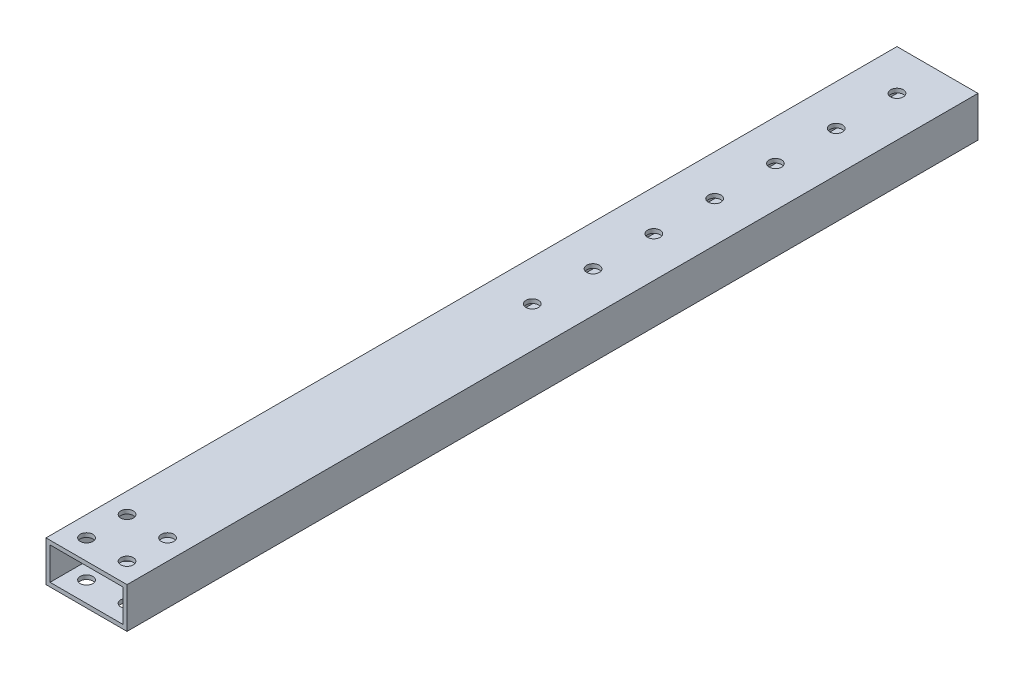
ISO-10303-21;
HEADER;
FILE_DESCRIPTION(('STEP AP214'),'2;1');
FILE_NAME('part.step','',(''),(''),'','','');
FILE_SCHEMA(('AUTOMOTIVE_DESIGN { 1 0 10303 214 1 1 1 1 }'));
ENDSEC;
DATA;
#1=APPLICATION_CONTEXT('core data for automotive mechanical design processes');
#2=APPLICATION_PROTOCOL_DEFINITION('international standard','automotive_design',2000,#1);
#3=PRODUCT_CONTEXT('',#1,'mechanical');
#4=PRODUCT('Part','Part','',(#3));
#5=PRODUCT_RELATED_PRODUCT_CATEGORY('part','',(#4));
#6=PRODUCT_DEFINITION_FORMATION('','',#4);
#7=PRODUCT_DEFINITION_CONTEXT('part definition',#1,'design');
#8=PRODUCT_DEFINITION('design','',#6,#7);
#9=PRODUCT_DEFINITION_SHAPE('','',#8);
#10=(LENGTH_UNIT() NAMED_UNIT(*) SI_UNIT(.MILLI.,.METRE.));
#11=(NAMED_UNIT(*) PLANE_ANGLE_UNIT() SI_UNIT($,.RADIAN.));
#12=(NAMED_UNIT(*) SI_UNIT($,.STERADIAN.) SOLID_ANGLE_UNIT());
#13=UNCERTAINTY_MEASURE_WITH_UNIT(LENGTH_MEASURE(1.E-05),#10,'distance_accuracy_value','');
#14=(GEOMETRIC_REPRESENTATION_CONTEXT(3) GLOBAL_UNCERTAINTY_ASSIGNED_CONTEXT((#13)) GLOBAL_UNIT_ASSIGNED_CONTEXT((#10,
#11,#12)) REPRESENTATION_CONTEXT('',''));
#15=CARTESIAN_POINT('',(0.,0.,0.));
#16=DIRECTION('',(0.,0.,1.));
#17=DIRECTION('',(1.,0.,0.));
#18=AXIS2_PLACEMENT_3D('',#15,#16,#17);
#19=CARTESIAN_POINT('',(0.,0.,-210.));
#20=DIRECTION('',(0.,0.,1.));
#21=DIRECTION('',(-1.,0.,0.));
#22=AXIS2_PLACEMENT_3D('',#19,#20,#21);
#23=PLANE('',#22);
#24=DIRECTION('',(0.,-1.,0.));
#25=VECTOR('',#24,1.);
#26=CARTESIAN_POINT('',(0.,0.,-210.));
#27=LINE('',#26,#25);
#28=CARTESIAN_POINT('',(0.,10.,-210.));
#29=VERTEX_POINT('',#28);
#30=CARTESIAN_POINT('',(0.,0.,-210.));
#31=VERTEX_POINT('',#30);
#32=EDGE_CURVE('E167',#29,#31,#27,.T.);
#33=ORIENTED_EDGE('',*,*,#32,.F.);
#34=DIRECTION('',(-1.,0.,0.));
#35=VECTOR('',#34,1.);
#36=CARTESIAN_POINT('',(0.,10.,-210.));
#37=LINE('',#36,#35);
#38=CARTESIAN_POINT('',(20.,10.,-210.));
#39=VERTEX_POINT('',#38);
#40=EDGE_CURVE('E180',#39,#29,#37,.T.);
#41=ORIENTED_EDGE('',*,*,#40,.F.);
#42=DIRECTION('',(0.,1.,0.));
#43=VECTOR('',#42,1.);
#44=CARTESIAN_POINT('',(20.,0.,-210.));
#45=LINE('',#44,#43);
#46=CARTESIAN_POINT('',(20.,0.,-210.));
#47=VERTEX_POINT('',#46);
#48=EDGE_CURVE('E176',#47,#39,#45,.T.);
#49=ORIENTED_EDGE('',*,*,#48,.F.);
#50=DIRECTION('',(1.,0.,0.));
#51=VECTOR('',#50,1.);
#52=CARTESIAN_POINT('',(0.,0.,-210.));
#53=LINE('',#52,#51);
#54=EDGE_CURVE('E171',#31,#47,#53,.T.);
#55=ORIENTED_EDGE('',*,*,#54,.F.);
#56=EDGE_LOOP('',(#33,#41,#49,#55));
#57=FACE_BOUND('',#56,.T.);
#58=DIRECTION('',(1.,0.,0.));
#59=VECTOR('',#58,1.);
#60=CARTESIAN_POINT('',(1.,1.,-210.));
#61=LINE('',#60,#59);
#62=CARTESIAN_POINT('',(1.,1.,-210.));
#63=VERTEX_POINT('',#62);
#64=CARTESIAN_POINT('',(19.,1.,-210.));
#65=VERTEX_POINT('',#64);
#66=EDGE_CURVE('E119',#63,#65,#61,.T.);
#67=ORIENTED_EDGE('',*,*,#66,.T.);
#68=DIRECTION('',(0.,1.,0.));
#69=VECTOR('',#68,1.);
#70=CARTESIAN_POINT('',(19.,1.,-210.));
#71=LINE('',#70,#69);
#72=CARTESIAN_POINT('',(19.,9.,-210.));
#73=VERTEX_POINT('',#72);
#74=EDGE_CURVE('E129',#65,#73,#71,.T.);
#75=ORIENTED_EDGE('',*,*,#74,.T.);
#76=DIRECTION('',(-1.,0.,0.));
#77=VECTOR('',#76,1.);
#78=CARTESIAN_POINT('',(1.,9.,-210.));
#79=LINE('',#78,#77);
#80=CARTESIAN_POINT('',(1.,9.,-210.));
#81=VERTEX_POINT('',#80);
#82=EDGE_CURVE('E134',#73,#81,#79,.T.);
#83=ORIENTED_EDGE('',*,*,#82,.T.);
#84=DIRECTION('',(0.,-1.,0.));
#85=VECTOR('',#84,1.);
#86=CARTESIAN_POINT('',(1.,1.,-210.));
#87=LINE('',#86,#85);
#88=EDGE_CURVE('E137',#81,#63,#87,.T.);
#89=ORIENTED_EDGE('',*,*,#88,.T.);
#90=EDGE_LOOP('',(#67,#75,#83,#89));
#91=FACE_BOUND('',#90,.T.);
#92=ADVANCED_FACE('F49',(#57,#91),#23,.F.);
#93=CARTESIAN_POINT('',(0.,0.,0.));
#94=DIRECTION('',(0.,0.,1.));
#95=DIRECTION('',(-1.,0.,0.));
#96=AXIS2_PLACEMENT_3D('',#93,#94,#95);
#97=PLANE('',#96);
#98=DIRECTION('',(0.,-1.,0.));
#99=VECTOR('',#98,1.);
#100=CARTESIAN_POINT('',(0.,0.,0.));
#101=LINE('',#100,#99);
#102=CARTESIAN_POINT('',(0.,10.,0.));
#103=VERTEX_POINT('',#102);
#104=CARTESIAN_POINT('',(0.,0.,0.));
#105=VERTEX_POINT('',#104);
#106=EDGE_CURVE('E125',#103,#105,#101,.T.);
#107=ORIENTED_EDGE('',*,*,#106,.T.);
#108=DIRECTION('',(1.,0.,0.));
#109=VECTOR('',#108,1.);
#110=CARTESIAN_POINT('',(0.,0.,0.));
#111=LINE('',#110,#109);
#112=CARTESIAN_POINT('',(20.,0.,0.));
#113=VERTEX_POINT('',#112);
#114=EDGE_CURVE('E187',#105,#113,#111,.T.);
#115=ORIENTED_EDGE('',*,*,#114,.T.);
#116=DIRECTION('',(0.,1.,0.));
#117=VECTOR('',#116,1.);
#118=CARTESIAN_POINT('',(20.,0.,0.));
#119=LINE('',#118,#117);
#120=CARTESIAN_POINT('',(20.,10.,0.));
#121=VERTEX_POINT('',#120);
#122=EDGE_CURVE('E191',#113,#121,#119,.T.);
#123=ORIENTED_EDGE('',*,*,#122,.T.);
#124=DIRECTION('',(-1.,0.,0.));
#125=VECTOR('',#124,1.);
#126=CARTESIAN_POINT('',(0.,10.,0.));
#127=LINE('',#126,#125);
#128=EDGE_CURVE('E172',#121,#103,#127,.T.);
#129=ORIENTED_EDGE('',*,*,#128,.T.);
#130=EDGE_LOOP('',(#107,#115,#123,#129));
#131=FACE_BOUND('',#130,.T.);
#132=DIRECTION('',(0.,-1.,0.));
#133=VECTOR('',#132,1.);
#134=CARTESIAN_POINT('',(1.,1.,0.));
#135=LINE('',#134,#133);
#136=CARTESIAN_POINT('',(1.,9.,0.));
#137=VERTEX_POINT('',#136);
#138=CARTESIAN_POINT('',(1.,1.,0.));
#139=VERTEX_POINT('',#138);
#140=EDGE_CURVE('E139',#137,#139,#135,.T.);
#141=ORIENTED_EDGE('',*,*,#140,.F.);
#142=DIRECTION('',(-1.,0.,0.));
#143=VECTOR('',#142,1.);
#144=CARTESIAN_POINT('',(1.,9.,0.));
#145=LINE('',#144,#143);
#146=CARTESIAN_POINT('',(19.,9.,0.));
#147=VERTEX_POINT('',#146);
#148=EDGE_CURVE('E144',#147,#137,#145,.T.);
#149=ORIENTED_EDGE('',*,*,#148,.F.);
#150=DIRECTION('',(0.,1.,0.));
#151=VECTOR('',#150,1.);
#152=CARTESIAN_POINT('',(19.,1.,0.));
#153=LINE('',#152,#151);
#154=CARTESIAN_POINT('',(19.,1.,0.));
#155=VERTEX_POINT('',#154);
#156=EDGE_CURVE('E156',#155,#147,#153,.T.);
#157=ORIENTED_EDGE('',*,*,#156,.F.);
#158=DIRECTION('',(1.,0.,0.));
#159=VECTOR('',#158,1.);
#160=CARTESIAN_POINT('',(1.,1.,0.));
#161=LINE('',#160,#159);
#162=EDGE_CURVE('E120',#139,#155,#161,.T.);
#163=ORIENTED_EDGE('',*,*,#162,.F.);
#164=EDGE_LOOP('',(#141,#149,#157,#163));
#165=FACE_BOUND('',#164,.T.);
#166=ADVANCED_FACE('F337',(#131,#165),#97,.T.);
#167=CARTESIAN_POINT('',(0.,0.,-210.));
#168=DIRECTION('',(1.,0.,0.));
#169=DIRECTION('',(0.,0.,1.));
#170=AXIS2_PLACEMENT_3D('',#167,#168,#169);
#171=PLANE('',#170);
#172=ORIENTED_EDGE('',*,*,#106,.F.);
#173=DIRECTION('',(0.,0.,1.));
#174=VECTOR('',#173,1.);
#175=CARTESIAN_POINT('',(0.,10.,-210.));
#176=LINE('',#175,#174);
#177=EDGE_CURVE('E184',#29,#103,#176,.T.);
#178=ORIENTED_EDGE('',*,*,#177,.F.);
#179=ORIENTED_EDGE('',*,*,#32,.T.);
#180=DIRECTION('',(0.,0.,1.));
#181=VECTOR('',#180,1.);
#182=CARTESIAN_POINT('',(0.,0.,-210.));
#183=LINE('',#182,#181);
#184=EDGE_CURVE('E11',#31,#105,#183,.T.);
#185=ORIENTED_EDGE('',*,*,#184,.T.);
#186=EDGE_LOOP('',(#172,#178,#179,#185));
#187=FACE_BOUND('',#186,.T.);
#188=ADVANCED_FACE('F51',(#187),#171,.F.);
#189=CARTESIAN_POINT('',(0.,0.,-210.));
#190=DIRECTION('',(0.,1.,0.));
#191=DIRECTION('',(0.,0.,-1.));
#192=AXIS2_PLACEMENT_3D('',#189,#190,#191);
#193=PLANE('',#192);
#194=CARTESIAN_POINT('',(10.,0.,-200.));
#195=DIRECTION('',(0.,1.,0.));
#196=DIRECTION('',(0.,0.,1.));
#197=AXIS2_PLACEMENT_3D('',#194,#195,#196);
#198=CIRCLE('',#197,1.55);
#199=CARTESIAN_POINT('',(10.,0.,-198.45));
#200=VERTEX_POINT('',#199);
#201=EDGE_CURVE('E442',#200,#200,#198,.T.);
#202=ORIENTED_EDGE('',*,*,#201,.T.);
#203=EDGE_LOOP('',(#202));
#204=FACE_BOUND('',#203,.T.);
#205=CARTESIAN_POINT('',(10.0000000000002,0.,-185.));
#206=DIRECTION('',(0.,1.,0.));
#207=DIRECTION('',(0.,0.,1.));
#208=AXIS2_PLACEMENT_3D('',#205,#206,#207);
#209=CIRCLE('',#208,1.55);
#210=CARTESIAN_POINT('',(10.0000000000002,0.,-183.45));
#211=VERTEX_POINT('',#210);
#212=EDGE_CURVE('E444',#211,#211,#209,.T.);
#213=ORIENTED_EDGE('',*,*,#212,.T.);
#214=EDGE_LOOP('',(#213));
#215=FACE_BOUND('',#214,.T.);
#216=CARTESIAN_POINT('',(10.0000000000003,0.,-170.));
#217=DIRECTION('',(0.,1.,0.));
#218=DIRECTION('',(0.,0.,1.));
#219=AXIS2_PLACEMENT_3D('',#216,#217,#218);
#220=CIRCLE('',#219,1.55);
#221=CARTESIAN_POINT('',(10.0000000000003,0.,-168.45));
#222=VERTEX_POINT('',#221);
#223=EDGE_CURVE('E457',#222,#222,#220,.T.);
#224=ORIENTED_EDGE('',*,*,#223,.T.);
#225=EDGE_LOOP('',(#224));
#226=FACE_BOUND('',#225,.T.);
#227=CARTESIAN_POINT('',(10.0000000000005,0.,-155.));
#228=DIRECTION('',(0.,1.,0.));
#229=DIRECTION('',(0.,0.,1.));
#230=AXIS2_PLACEMENT_3D('',#227,#228,#229);
#231=CIRCLE('',#230,1.54999999999999);
#232=CARTESIAN_POINT('',(10.0000000000005,0.,-153.45));
#233=VERTEX_POINT('',#232);
#234=EDGE_CURVE('E465',#233,#233,#231,.T.);
#235=ORIENTED_EDGE('',*,*,#234,.T.);
#236=EDGE_LOOP('',(#235));
#237=FACE_BOUND('',#236,.T.);
#238=CARTESIAN_POINT('',(10.0000000000006,0.,-140.));
#239=DIRECTION('',(0.,1.,0.));
#240=DIRECTION('',(0.,0.,1.));
#241=AXIS2_PLACEMENT_3D('',#238,#239,#240);
#242=CIRCLE('',#241,1.55);
#243=CARTESIAN_POINT('',(10.0000000000006,0.,-138.45));
#244=VERTEX_POINT('',#243);
#245=EDGE_CURVE('E473',#244,#244,#242,.T.);
#246=ORIENTED_EDGE('',*,*,#245,.T.);
#247=EDGE_LOOP('',(#246));
#248=FACE_BOUND('',#247,.T.);
#249=CARTESIAN_POINT('',(10.0000000000018,0.,-125.));
#250=DIRECTION('',(0.,1.,0.));
#251=DIRECTION('',(0.,0.,1.));
#252=AXIS2_PLACEMENT_3D('',#249,#250,#251);
#253=CIRCLE('',#252,1.55);
#254=CARTESIAN_POINT('',(10.0000000000018,0.,-123.45));
#255=VERTEX_POINT('',#254);
#256=EDGE_CURVE('E480',#255,#255,#253,.T.);
#257=ORIENTED_EDGE('',*,*,#256,.T.);
#258=EDGE_LOOP('',(#257));
#259=FACE_BOUND('',#258,.T.);
#260=CARTESIAN_POINT('',(10.0000000000022,0.,-110.));
#261=DIRECTION('',(0.,1.,0.));
#262=DIRECTION('',(0.,0.,1.));
#263=AXIS2_PLACEMENT_3D('',#260,#261,#262);
#264=CIRCLE('',#263,1.55);
#265=CARTESIAN_POINT('',(10.0000000000022,0.,-108.45));
#266=VERTEX_POINT('',#265);
#267=EDGE_CURVE('E488',#266,#266,#264,.T.);
#268=ORIENTED_EDGE('',*,*,#267,.T.);
#269=EDGE_LOOP('',(#268));
#270=FACE_BOUND('',#269,.T.);
#271=CARTESIAN_POINT('',(4.99999999999997,0.,-15.));
#272=DIRECTION('',(0.,1.,0.));
#273=DIRECTION('',(0.,0.,1.));
#274=AXIS2_PLACEMENT_3D('',#271,#272,#273);
#275=CIRCLE('',#274,1.55);
#276=CARTESIAN_POINT('',(4.99999999999997,0.,-13.45));
#277=VERTEX_POINT('',#276);
#278=EDGE_CURVE('E289',#277,#277,#275,.T.);
#279=ORIENTED_EDGE('',*,*,#278,.T.);
#280=EDGE_LOOP('',(#279));
#281=FACE_BOUND('',#280,.T.);
#282=CARTESIAN_POINT('',(15.,0.,-15.0000000000001));
#283=DIRECTION('',(0.,1.,0.));
#284=DIRECTION('',(0.,0.,1.));
#285=AXIS2_PLACEMENT_3D('',#282,#283,#284);
#286=CIRCLE('',#285,1.55);
#287=CARTESIAN_POINT('',(15.,0.,-13.4500000000001));
#288=VERTEX_POINT('',#287);
#289=EDGE_CURVE('E281',#288,#288,#286,.T.);
#290=ORIENTED_EDGE('',*,*,#289,.T.);
#291=EDGE_LOOP('',(#290));
#292=FACE_BOUND('',#291,.T.);
#293=CARTESIAN_POINT('',(15.,0.,-5.00000000000014));
#294=DIRECTION('',(0.,1.,0.));
#295=DIRECTION('',(0.,0.,1.));
#296=AXIS2_PLACEMENT_3D('',#293,#294,#295);
#297=CIRCLE('',#296,1.55);
#298=CARTESIAN_POINT('',(15.,0.,-3.45000000000014));
#299=VERTEX_POINT('',#298);
#300=EDGE_CURVE('E273',#299,#299,#297,.T.);
#301=ORIENTED_EDGE('',*,*,#300,.T.);
#302=EDGE_LOOP('',(#301));
#303=FACE_BOUND('',#302,.T.);
#304=CARTESIAN_POINT('',(5.,0.,-5.));
#305=DIRECTION('',(0.,1.,0.));
#306=DIRECTION('',(0.,0.,1.));
#307=AXIS2_PLACEMENT_3D('',#304,#305,#306);
#308=CIRCLE('',#307,1.55);
#309=CARTESIAN_POINT('',(5.,0.,-3.45));
#310=VERTEX_POINT('',#309);
#311=EDGE_CURVE('E277',#310,#310,#308,.T.);
#312=ORIENTED_EDGE('',*,*,#311,.T.);
#313=EDGE_LOOP('',(#312));
#314=FACE_BOUND('',#313,.T.);
#315=ORIENTED_EDGE('',*,*,#114,.F.);
#316=ORIENTED_EDGE('',*,*,#184,.F.);
#317=ORIENTED_EDGE('',*,*,#54,.T.);
#318=DIRECTION('',(0.,0.,1.));
#319=VECTOR('',#318,1.);
#320=CARTESIAN_POINT('',(20.,0.,-210.));
#321=LINE('',#320,#319);
#322=EDGE_CURVE('E59',#47,#113,#321,.T.);
#323=ORIENTED_EDGE('',*,*,#322,.T.);
#324=EDGE_LOOP('',(#315,#316,#317,#323));
#325=FACE_BOUND('',#324,.T.);
#326=ADVANCED_FACE('F323',(#204,#215,#226,#237,#248,#259,#270,#281,#292,#303,#314,#325),#193,.F.);
#327=CARTESIAN_POINT('',(20.,0.,-210.));
#328=DIRECTION('',(-1.,0.,0.));
#329=DIRECTION('',(0.,0.,-1.));
#330=AXIS2_PLACEMENT_3D('',#327,#328,#329);
#331=PLANE('',#330);
#332=ORIENTED_EDGE('',*,*,#122,.F.);
#333=ORIENTED_EDGE('',*,*,#322,.F.);
#334=ORIENTED_EDGE('',*,*,#48,.T.);
#335=DIRECTION('',(0.,0.,1.));
#336=VECTOR('',#335,1.);
#337=CARTESIAN_POINT('',(20.,10.,-210.));
#338=LINE('',#337,#336);
#339=EDGE_CURVE('E200',#39,#121,#338,.T.);
#340=ORIENTED_EDGE('',*,*,#339,.T.);
#341=EDGE_LOOP('',(#332,#333,#334,#340));
#342=FACE_BOUND('',#341,.T.);
#343=ADVANCED_FACE('F326',(#342),#331,.F.);
#344=CARTESIAN_POINT('',(0.,10.,-210.));
#345=DIRECTION('',(0.,-1.,0.));
#346=DIRECTION('',(0.,0.,1.));
#347=AXIS2_PLACEMENT_3D('',#344,#345,#346);
#348=PLANE('',#347);
#349=CARTESIAN_POINT('',(10.,10.,-200.));
#350=DIRECTION('',(0.,1.,0.));
#351=DIRECTION('',(0.,0.,1.));
#352=AXIS2_PLACEMENT_3D('',#349,#350,#351);
#353=CIRCLE('',#352,1.55);
#354=CARTESIAN_POINT('',(10.,10.,-198.45));
#355=VERTEX_POINT('',#354);
#356=EDGE_CURVE('E230',#355,#355,#353,.T.);
#357=ORIENTED_EDGE('',*,*,#356,.F.);
#358=EDGE_LOOP('',(#357));
#359=FACE_BOUND('',#358,.T.);
#360=CARTESIAN_POINT('',(10.0000000000002,10.,-185.));
#361=DIRECTION('',(0.,1.,0.));
#362=DIRECTION('',(0.,0.,1.));
#363=AXIS2_PLACEMENT_3D('',#360,#361,#362);
#364=CIRCLE('',#363,1.55);
#365=CARTESIAN_POINT('',(10.0000000000002,10.,-183.45));
#366=VERTEX_POINT('',#365);
#367=EDGE_CURVE('E451',#366,#366,#364,.T.);
#368=ORIENTED_EDGE('',*,*,#367,.F.);
#369=EDGE_LOOP('',(#368));
#370=FACE_BOUND('',#369,.T.);
#371=CARTESIAN_POINT('',(10.0000000000003,10.,-170.));
#372=DIRECTION('',(0.,1.,0.));
#373=DIRECTION('',(0.,0.,1.));
#374=AXIS2_PLACEMENT_3D('',#371,#372,#373);
#375=CIRCLE('',#374,1.55);
#376=CARTESIAN_POINT('',(10.0000000000003,10.,-168.45));
#377=VERTEX_POINT('',#376);
#378=EDGE_CURVE('E461',#377,#377,#375,.T.);
#379=ORIENTED_EDGE('',*,*,#378,.F.);
#380=EDGE_LOOP('',(#379));
#381=FACE_BOUND('',#380,.T.);
#382=CARTESIAN_POINT('',(10.0000000000005,10.,-155.));
#383=DIRECTION('',(0.,1.,0.));
#384=DIRECTION('',(0.,0.,1.));
#385=AXIS2_PLACEMENT_3D('',#382,#383,#384);
#386=CIRCLE('',#385,1.54999999999999);
#387=CARTESIAN_POINT('',(10.0000000000005,10.,-153.45));
#388=VERTEX_POINT('',#387);
#389=EDGE_CURVE('E469',#388,#388,#386,.T.);
#390=ORIENTED_EDGE('',*,*,#389,.F.);
#391=EDGE_LOOP('',(#390));
#392=FACE_BOUND('',#391,.T.);
#393=CARTESIAN_POINT('',(10.0000000000006,10.,-140.));
#394=DIRECTION('',(0.,1.,0.));
#395=DIRECTION('',(0.,0.,1.));
#396=AXIS2_PLACEMENT_3D('',#393,#394,#395);
#397=CIRCLE('',#396,1.55);
#398=CARTESIAN_POINT('',(10.0000000000006,10.,-138.45));
#399=VERTEX_POINT('',#398);
#400=EDGE_CURVE('E477',#399,#399,#397,.T.);
#401=ORIENTED_EDGE('',*,*,#400,.F.);
#402=EDGE_LOOP('',(#401));
#403=FACE_BOUND('',#402,.T.);
#404=CARTESIAN_POINT('',(10.0000000000018,10.,-125.));
#405=DIRECTION('',(0.,1.,0.));
#406=DIRECTION('',(0.,0.,1.));
#407=AXIS2_PLACEMENT_3D('',#404,#405,#406);
#408=CIRCLE('',#407,1.55);
#409=CARTESIAN_POINT('',(10.0000000000018,10.,-123.45));
#410=VERTEX_POINT('',#409);
#411=EDGE_CURVE('E484',#410,#410,#408,.T.);
#412=ORIENTED_EDGE('',*,*,#411,.F.);
#413=EDGE_LOOP('',(#412));
#414=FACE_BOUND('',#413,.T.);
#415=CARTESIAN_POINT('',(10.0000000000022,10.,-110.));
#416=DIRECTION('',(0.,1.,0.));
#417=DIRECTION('',(0.,0.,1.));
#418=AXIS2_PLACEMENT_3D('',#415,#416,#417);
#419=CIRCLE('',#418,1.55);
#420=CARTESIAN_POINT('',(10.0000000000022,10.,-108.45));
#421=VERTEX_POINT('',#420);
#422=EDGE_CURVE('E492',#421,#421,#419,.T.);
#423=ORIENTED_EDGE('',*,*,#422,.F.);
#424=EDGE_LOOP('',(#423));
#425=FACE_BOUND('',#424,.T.);
#426=CARTESIAN_POINT('',(4.99999999999997,10.,-15.));
#427=DIRECTION('',(0.,1.,0.));
#428=DIRECTION('',(0.,0.,1.));
#429=AXIS2_PLACEMENT_3D('',#426,#427,#428);
#430=CIRCLE('',#429,1.55);
#431=CARTESIAN_POINT('',(4.99999999999997,10.,-13.45));
#432=VERTEX_POINT('',#431);
#433=EDGE_CURVE('E272',#432,#432,#430,.T.);
#434=ORIENTED_EDGE('',*,*,#433,.F.);
#435=EDGE_LOOP('',(#434));
#436=FACE_BOUND('',#435,.T.);
#437=CARTESIAN_POINT('',(15.,10.,-15.0000000000001));
#438=DIRECTION('',(0.,1.,0.));
#439=DIRECTION('',(0.,0.,1.));
#440=AXIS2_PLACEMENT_3D('',#437,#438,#439);
#441=CIRCLE('',#440,1.55);
#442=CARTESIAN_POINT('',(15.,10.,-13.4500000000001));
#443=VERTEX_POINT('',#442);
#444=EDGE_CURVE('E285',#443,#443,#441,.T.);
#445=ORIENTED_EDGE('',*,*,#444,.F.);
#446=EDGE_LOOP('',(#445));
#447=FACE_BOUND('',#446,.T.);
#448=CARTESIAN_POINT('',(15.,10.,-5.00000000000014));
#449=DIRECTION('',(0.,1.,0.));
#450=DIRECTION('',(0.,0.,1.));
#451=AXIS2_PLACEMENT_3D('',#448,#449,#450);
#452=CIRCLE('',#451,1.55);
#453=CARTESIAN_POINT('',(15.,10.,-3.45000000000014));
#454=VERTEX_POINT('',#453);
#455=EDGE_CURVE('E278',#454,#454,#452,.T.);
#456=ORIENTED_EDGE('',*,*,#455,.F.);
#457=EDGE_LOOP('',(#456));
#458=FACE_BOUND('',#457,.T.);
#459=CARTESIAN_POINT('',(5.,10.,-5.));
#460=DIRECTION('',(0.,1.,0.));
#461=DIRECTION('',(0.,0.,1.));
#462=AXIS2_PLACEMENT_3D('',#459,#460,#461);
#463=CIRCLE('',#462,1.55);
#464=CARTESIAN_POINT('',(5.,10.,-3.45));
#465=VERTEX_POINT('',#464);
#466=EDGE_CURVE('E210',#465,#465,#463,.T.);
#467=ORIENTED_EDGE('',*,*,#466,.F.);
#468=EDGE_LOOP('',(#467));
#469=FACE_BOUND('',#468,.T.);
#470=ORIENTED_EDGE('',*,*,#128,.F.);
#471=ORIENTED_EDGE('',*,*,#339,.F.);
#472=ORIENTED_EDGE('',*,*,#40,.T.);
#473=ORIENTED_EDGE('',*,*,#177,.T.);
#474=EDGE_LOOP('',(#470,#471,#472,#473));
#475=FACE_BOUND('',#474,.T.);
#476=ADVANCED_FACE('F347',(#359,#370,#381,#392,#403,#414,#425,#436,#447,#458,#469,#475),#348,.F.);
#477=CARTESIAN_POINT('',(1.,1.,-210.));
#478=DIRECTION('',(0.,1.,0.));
#479=DIRECTION('',(0.,0.,-1.));
#480=AXIS2_PLACEMENT_3D('',#477,#478,#479);
#481=PLANE('',#480);
#482=CARTESIAN_POINT('',(10.,0.999999999999999,-200.));
#483=DIRECTION('',(0.,-1.,0.));
#484=DIRECTION('',(0.,0.,-1.));
#485=AXIS2_PLACEMENT_3D('',#482,#483,#484);
#486=CIRCLE('',#485,1.55);
#487=CARTESIAN_POINT('',(10.,0.999999999999999,-201.55));
#488=VERTEX_POINT('',#487);
#489=EDGE_CURVE('E268',#488,#488,#486,.T.);
#490=ORIENTED_EDGE('',*,*,#489,.T.);
#491=EDGE_LOOP('',(#490));
#492=FACE_BOUND('',#491,.T.);
#493=CARTESIAN_POINT('',(10.0000000000002,0.999999999999999,-185.));
#494=DIRECTION('',(0.,-1.,0.));
#495=DIRECTION('',(0.,0.,-1.));
#496=AXIS2_PLACEMENT_3D('',#493,#494,#495);
#497=CIRCLE('',#496,1.55);
#498=CARTESIAN_POINT('',(10.0000000000002,0.999999999999999,-186.55));
#499=VERTEX_POINT('',#498);
#500=EDGE_CURVE('E253',#499,#499,#497,.T.);
#501=ORIENTED_EDGE('',*,*,#500,.T.);
#502=EDGE_LOOP('',(#501));
#503=FACE_BOUND('',#502,.T.);
#504=CARTESIAN_POINT('',(10.0000000000003,0.999999999999999,-170.));
#505=DIRECTION('',(0.,-1.,0.));
#506=DIRECTION('',(0.,0.,-1.));
#507=AXIS2_PLACEMENT_3D('',#504,#505,#506);
#508=CIRCLE('',#507,1.55);
#509=CARTESIAN_POINT('',(10.0000000000003,0.999999999999999,-171.55));
#510=VERTEX_POINT('',#509);
#511=EDGE_CURVE('E249',#510,#510,#508,.T.);
#512=ORIENTED_EDGE('',*,*,#511,.T.);
#513=EDGE_LOOP('',(#512));
#514=FACE_BOUND('',#513,.T.);
#515=CARTESIAN_POINT('',(10.0000000000005,0.999999999999999,-155.));
#516=DIRECTION('',(0.,-1.,0.));
#517=DIRECTION('',(0.,0.,-1.));
#518=AXIS2_PLACEMENT_3D('',#515,#516,#517);
#519=CIRCLE('',#518,1.54999999999999);
#520=CARTESIAN_POINT('',(10.0000000000005,0.999999999999999,-156.55));
#521=VERTEX_POINT('',#520);
#522=EDGE_CURVE('E245',#521,#521,#519,.T.);
#523=ORIENTED_EDGE('',*,*,#522,.T.);
#524=EDGE_LOOP('',(#523));
#525=FACE_BOUND('',#524,.T.);
#526=CARTESIAN_POINT('',(10.0000000000006,0.999999999999999,-140.));
#527=DIRECTION('',(0.,-1.,0.));
#528=DIRECTION('',(0.,0.,-1.));
#529=AXIS2_PLACEMENT_3D('',#526,#527,#528);
#530=CIRCLE('',#529,1.55);
#531=CARTESIAN_POINT('',(10.0000000000006,0.999999999999999,-141.55));
#532=VERTEX_POINT('',#531);
#533=EDGE_CURVE('E240',#532,#532,#530,.T.);
#534=ORIENTED_EDGE('',*,*,#533,.T.);
#535=EDGE_LOOP('',(#534));
#536=FACE_BOUND('',#535,.T.);
#537=CARTESIAN_POINT('',(10.0000000000018,0.999999999999999,-125.));
#538=DIRECTION('',(0.,-1.,0.));
#539=DIRECTION('',(0.,0.,-1.));
#540=AXIS2_PLACEMENT_3D('',#537,#538,#539);
#541=CIRCLE('',#540,1.55);
#542=CARTESIAN_POINT('',(10.0000000000018,0.999999999999999,-126.55));
#543=VERTEX_POINT('',#542);
#544=EDGE_CURVE('E235',#543,#543,#541,.T.);
#545=ORIENTED_EDGE('',*,*,#544,.T.);
#546=EDGE_LOOP('',(#545));
#547=FACE_BOUND('',#546,.T.);
#548=CARTESIAN_POINT('',(10.0000000000022,0.999999999999999,-110.));
#549=DIRECTION('',(0.,-1.,0.));
#550=DIRECTION('',(0.,0.,-1.));
#551=AXIS2_PLACEMENT_3D('',#548,#549,#550);
#552=CIRCLE('',#551,1.55);
#553=CARTESIAN_POINT('',(10.0000000000022,0.999999999999999,-111.55));
#554=VERTEX_POINT('',#553);
#555=EDGE_CURVE('E229',#554,#554,#552,.T.);
#556=ORIENTED_EDGE('',*,*,#555,.T.);
#557=EDGE_LOOP('',(#556));
#558=FACE_BOUND('',#557,.T.);
#559=CARTESIAN_POINT('',(4.99999999999997,0.999999999999999,-15.));
#560=DIRECTION('',(0.,-1.,0.));
#561=DIRECTION('',(0.,0.,-1.));
#562=AXIS2_PLACEMENT_3D('',#559,#560,#561);
#563=CIRCLE('',#562,1.55);
#564=CARTESIAN_POINT('',(4.99999999999997,0.999999999999999,-16.55));
#565=VERTEX_POINT('',#564);
#566=EDGE_CURVE('E147',#565,#565,#563,.T.);
#567=ORIENTED_EDGE('',*,*,#566,.T.);
#568=EDGE_LOOP('',(#567));
#569=FACE_BOUND('',#568,.T.);
#570=CARTESIAN_POINT('',(15.,0.999999999999999,-15.0000000000001));
#571=DIRECTION('',(0.,-1.,0.));
#572=DIRECTION('',(0.,0.,-1.));
#573=AXIS2_PLACEMENT_3D('',#570,#571,#572);
#574=CIRCLE('',#573,1.55);
#575=CARTESIAN_POINT('',(15.,0.999999999999999,-16.5500000000001));
#576=VERTEX_POINT('',#575);
#577=EDGE_CURVE('E220',#576,#576,#574,.T.);
#578=ORIENTED_EDGE('',*,*,#577,.T.);
#579=EDGE_LOOP('',(#578));
#580=FACE_BOUND('',#579,.T.);
#581=CARTESIAN_POINT('',(15.,0.999999999999999,-5.00000000000014));
#582=DIRECTION('',(0.,-1.,0.));
#583=DIRECTION('',(0.,0.,-1.));
#584=AXIS2_PLACEMENT_3D('',#581,#582,#583);
#585=CIRCLE('',#584,1.55);
#586=CARTESIAN_POINT('',(15.,0.999999999999999,-6.55000000000015));
#587=VERTEX_POINT('',#586);
#588=EDGE_CURVE('E215',#587,#587,#585,.T.);
#589=ORIENTED_EDGE('',*,*,#588,.T.);
#590=EDGE_LOOP('',(#589));
#591=FACE_BOUND('',#590,.T.);
#592=CARTESIAN_POINT('',(5.,0.999999999999999,-5.));
#593=DIRECTION('',(0.,-1.,0.));
#594=DIRECTION('',(0.,0.,-1.));
#595=AXIS2_PLACEMENT_3D('',#592,#593,#594);
#596=CIRCLE('',#595,1.55);
#597=CARTESIAN_POINT('',(5.,0.999999999999999,-6.55));
#598=VERTEX_POINT('',#597);
#599=EDGE_CURVE('E209',#598,#598,#596,.T.);
#600=ORIENTED_EDGE('',*,*,#599,.T.);
#601=EDGE_LOOP('',(#600));
#602=FACE_BOUND('',#601,.T.);
#603=ORIENTED_EDGE('',*,*,#162,.T.);
#604=DIRECTION('',(0.,0.,1.));
#605=VECTOR('',#604,1.);
#606=CARTESIAN_POINT('',(19.,1.,-210.));
#607=LINE('',#606,#605);
#608=EDGE_CURVE('E115',#65,#155,#607,.T.);
#609=ORIENTED_EDGE('',*,*,#608,.F.);
#610=ORIENTED_EDGE('',*,*,#66,.F.);
#611=DIRECTION('',(0.,0.,1.));
#612=VECTOR('',#611,1.);
#613=CARTESIAN_POINT('',(1.,1.,-210.));
#614=LINE('',#613,#612);
#615=EDGE_CURVE('E75',#63,#139,#614,.T.);
#616=ORIENTED_EDGE('',*,*,#615,.T.);
#617=EDGE_LOOP('',(#603,#609,#610,#616));
#618=FACE_BOUND('',#617,.T.);
#619=ADVANCED_FACE('F117',(#492,#503,#514,#525,#536,#547,#558,#569,#580,#591,#602,#618),#481,.T.);
#620=CARTESIAN_POINT('',(19.,1.,-210.));
#621=DIRECTION('',(-1.,0.,0.));
#622=DIRECTION('',(0.,0.,-1.));
#623=AXIS2_PLACEMENT_3D('',#620,#621,#622);
#624=PLANE('',#623);
#625=ORIENTED_EDGE('',*,*,#156,.T.);
#626=DIRECTION('',(0.,0.,1.));
#627=VECTOR('',#626,1.);
#628=CARTESIAN_POINT('',(19.,9.,-210.));
#629=LINE('',#628,#627);
#630=EDGE_CURVE('E126',#73,#147,#629,.T.);
#631=ORIENTED_EDGE('',*,*,#630,.F.);
#632=ORIENTED_EDGE('',*,*,#74,.F.);
#633=ORIENTED_EDGE('',*,*,#608,.T.);
#634=EDGE_LOOP('',(#625,#631,#632,#633));
#635=FACE_BOUND('',#634,.T.);
#636=ADVANCED_FACE('F130',(#635),#624,.T.);
#637=CARTESIAN_POINT('',(1.,9.,-210.));
#638=DIRECTION('',(0.,-1.,0.));
#639=DIRECTION('',(0.,0.,1.));
#640=AXIS2_PLACEMENT_3D('',#637,#638,#639);
#641=PLANE('',#640);
#642=CARTESIAN_POINT('',(10.,9.,-200.));
#643=DIRECTION('',(0.,1.,0.));
#644=DIRECTION('',(0.,0.,1.));
#645=AXIS2_PLACEMENT_3D('',#642,#643,#644);
#646=CIRCLE('',#645,1.55);
#647=CARTESIAN_POINT('',(10.,9.,-198.45));
#648=VERTEX_POINT('',#647);
#649=EDGE_CURVE('E53',#648,#648,#646,.T.);
#650=ORIENTED_EDGE('',*,*,#649,.T.);
#651=EDGE_LOOP('',(#650));
#652=FACE_BOUND('',#651,.T.);
#653=CARTESIAN_POINT('',(10.0000000000002,9.,-185.));
#654=DIRECTION('',(0.,1.,0.));
#655=DIRECTION('',(0.,0.,1.));
#656=AXIS2_PLACEMENT_3D('',#653,#654,#655);
#657=CIRCLE('',#656,1.55);
#658=CARTESIAN_POINT('',(10.0000000000002,9.,-183.45));
#659=VERTEX_POINT('',#658);
#660=EDGE_CURVE('E250',#659,#659,#657,.T.);
#661=ORIENTED_EDGE('',*,*,#660,.T.);
#662=EDGE_LOOP('',(#661));
#663=FACE_BOUND('',#662,.T.);
#664=CARTESIAN_POINT('',(10.0000000000003,9.,-170.));
#665=DIRECTION('',(0.,1.,0.));
#666=DIRECTION('',(0.,0.,1.));
#667=AXIS2_PLACEMENT_3D('',#664,#665,#666);
#668=CIRCLE('',#667,1.55);
#669=CARTESIAN_POINT('',(10.0000000000003,9.,-168.45));
#670=VERTEX_POINT('',#669);
#671=EDGE_CURVE('E246',#670,#670,#668,.T.);
#672=ORIENTED_EDGE('',*,*,#671,.T.);
#673=EDGE_LOOP('',(#672));
#674=FACE_BOUND('',#673,.T.);
#675=CARTESIAN_POINT('',(10.0000000000005,9.,-155.));
#676=DIRECTION('',(0.,1.,0.));
#677=DIRECTION('',(0.,0.,1.));
#678=AXIS2_PLACEMENT_3D('',#675,#676,#677);
#679=CIRCLE('',#678,1.54999999999999);
#680=CARTESIAN_POINT('',(10.0000000000005,9.,-153.45));
#681=VERTEX_POINT('',#680);
#682=EDGE_CURVE('E241',#681,#681,#679,.T.);
#683=ORIENTED_EDGE('',*,*,#682,.T.);
#684=EDGE_LOOP('',(#683));
#685=FACE_BOUND('',#684,.T.);
#686=CARTESIAN_POINT('',(10.0000000000006,9.,-140.));
#687=DIRECTION('',(0.,1.,0.));
#688=DIRECTION('',(0.,0.,1.));
#689=AXIS2_PLACEMENT_3D('',#686,#687,#688);
#690=CIRCLE('',#689,1.55);
#691=CARTESIAN_POINT('',(10.0000000000006,9.,-138.45));
#692=VERTEX_POINT('',#691);
#693=EDGE_CURVE('E236',#692,#692,#690,.T.);
#694=ORIENTED_EDGE('',*,*,#693,.T.);
#695=EDGE_LOOP('',(#694));
#696=FACE_BOUND('',#695,.T.);
#697=CARTESIAN_POINT('',(10.0000000000018,9.,-125.));
#698=DIRECTION('',(0.,1.,0.));
#699=DIRECTION('',(0.,0.,1.));
#700=AXIS2_PLACEMENT_3D('',#697,#698,#699);
#701=CIRCLE('',#700,1.55);
#702=CARTESIAN_POINT('',(10.0000000000018,9.,-123.45));
#703=VERTEX_POINT('',#702);
#704=EDGE_CURVE('E231',#703,#703,#701,.T.);
#705=ORIENTED_EDGE('',*,*,#704,.T.);
#706=EDGE_LOOP('',(#705));
#707=FACE_BOUND('',#706,.T.);
#708=CARTESIAN_POINT('',(10.0000000000022,9.,-110.));
#709=DIRECTION('',(0.,1.,0.));
#710=DIRECTION('',(0.,0.,1.));
#711=AXIS2_PLACEMENT_3D('',#708,#709,#710);
#712=CIRCLE('',#711,1.55);
#713=CARTESIAN_POINT('',(10.0000000000022,9.,-108.45));
#714=VERTEX_POINT('',#713);
#715=EDGE_CURVE('E225',#714,#714,#712,.T.);
#716=ORIENTED_EDGE('',*,*,#715,.T.);
#717=EDGE_LOOP('',(#716));
#718=FACE_BOUND('',#717,.T.);
#719=CARTESIAN_POINT('',(4.99999999999997,9.,-15.));
#720=DIRECTION('',(0.,1.,0.));
#721=DIRECTION('',(0.,0.,1.));
#722=AXIS2_PLACEMENT_3D('',#719,#720,#721);
#723=CIRCLE('',#722,1.55);
#724=CARTESIAN_POINT('',(4.99999999999997,9.,-13.45));
#725=VERTEX_POINT('',#724);
#726=EDGE_CURVE('E221',#725,#725,#723,.T.);
#727=ORIENTED_EDGE('',*,*,#726,.T.);
#728=EDGE_LOOP('',(#727));
#729=FACE_BOUND('',#728,.T.);
#730=CARTESIAN_POINT('',(15.,9.,-15.0000000000001));
#731=DIRECTION('',(0.,1.,0.));
#732=DIRECTION('',(0.,0.,1.));
#733=AXIS2_PLACEMENT_3D('',#730,#731,#732);
#734=CIRCLE('',#733,1.55);
#735=CARTESIAN_POINT('',(15.,9.,-13.4500000000001));
#736=VERTEX_POINT('',#735);
#737=EDGE_CURVE('E216',#736,#736,#734,.T.);
#738=ORIENTED_EDGE('',*,*,#737,.T.);
#739=EDGE_LOOP('',(#738));
#740=FACE_BOUND('',#739,.T.);
#741=CARTESIAN_POINT('',(15.,9.,-5.00000000000014));
#742=DIRECTION('',(0.,1.,0.));
#743=DIRECTION('',(0.,0.,1.));
#744=AXIS2_PLACEMENT_3D('',#741,#742,#743);
#745=CIRCLE('',#744,1.55);
#746=CARTESIAN_POINT('',(15.,9.,-3.45000000000014));
#747=VERTEX_POINT('',#746);
#748=EDGE_CURVE('E211',#747,#747,#745,.T.);
#749=ORIENTED_EDGE('',*,*,#748,.T.);
#750=EDGE_LOOP('',(#749));
#751=FACE_BOUND('',#750,.T.);
#752=CARTESIAN_POINT('',(5.,9.,-5.));
#753=DIRECTION('',(0.,1.,0.));
#754=DIRECTION('',(0.,0.,1.));
#755=AXIS2_PLACEMENT_3D('',#752,#753,#754);
#756=CIRCLE('',#755,1.55);
#757=CARTESIAN_POINT('',(5.,9.,-3.45));
#758=VERTEX_POINT('',#757);
#759=EDGE_CURVE('E205',#758,#758,#756,.T.);
#760=ORIENTED_EDGE('',*,*,#759,.T.);
#761=EDGE_LOOP('',(#760));
#762=FACE_BOUND('',#761,.T.);
#763=ORIENTED_EDGE('',*,*,#148,.T.);
#764=DIRECTION('',(0.,0.,1.));
#765=VECTOR('',#764,1.);
#766=CARTESIAN_POINT('',(1.,9.,-210.));
#767=LINE('',#766,#765);
#768=EDGE_CURVE('E67',#81,#137,#767,.T.);
#769=ORIENTED_EDGE('',*,*,#768,.F.);
#770=ORIENTED_EDGE('',*,*,#82,.F.);
#771=ORIENTED_EDGE('',*,*,#630,.T.);
#772=EDGE_LOOP('',(#763,#769,#770,#771));
#773=FACE_BOUND('',#772,.T.);
#774=ADVANCED_FACE('F369',(#652,#663,#674,#685,#696,#707,#718,#729,#740,#751,#762,#773),#641,.T.);
#775=CARTESIAN_POINT('',(1.,1.,-210.));
#776=DIRECTION('',(1.,0.,0.));
#777=DIRECTION('',(0.,0.,1.));
#778=AXIS2_PLACEMENT_3D('',#775,#776,#777);
#779=PLANE('',#778);
#780=ORIENTED_EDGE('',*,*,#140,.T.);
#781=ORIENTED_EDGE('',*,*,#615,.F.);
#782=ORIENTED_EDGE('',*,*,#88,.F.);
#783=ORIENTED_EDGE('',*,*,#768,.T.);
#784=EDGE_LOOP('',(#780,#781,#782,#783));
#785=FACE_BOUND('',#784,.T.);
#786=ADVANCED_FACE('F372',(#785),#779,.T.);
#787=CARTESIAN_POINT('',(5.,10.,-5.));
#788=DIRECTION('',(0.,-1.,0.));
#789=DIRECTION('',(0.,0.,1.));
#790=AXIS2_PLACEMENT_3D('',#787,#788,#789);
#791=CYLINDRICAL_SURFACE('',#790,1.55);
#792=ORIENTED_EDGE('',*,*,#759,.F.);
#793=EDGE_LOOP('',(#792));
#794=FACE_BOUND('',#793,.T.);
#795=ORIENTED_EDGE('',*,*,#466,.T.);
#796=EDGE_LOOP('',(#795));
#797=FACE_BOUND('',#796,.T.);
#798=ADVANCED_FACE('F376',(#794,#797),#791,.F.);
#799=CARTESIAN_POINT('',(15.,10.,-5.00000000000014));
#800=DIRECTION('',(0.,-1.,0.));
#801=DIRECTION('',(0.,0.,1.));
#802=AXIS2_PLACEMENT_3D('',#799,#800,#801);
#803=CYLINDRICAL_SURFACE('',#802,1.55);
#804=ORIENTED_EDGE('',*,*,#748,.F.);
#805=EDGE_LOOP('',(#804));
#806=FACE_BOUND('',#805,.T.);
#807=ORIENTED_EDGE('',*,*,#455,.T.);
#808=EDGE_LOOP('',(#807));
#809=FACE_BOUND('',#808,.T.);
#810=ADVANCED_FACE('F380',(#806,#809),#803,.F.);
#811=CARTESIAN_POINT('',(15.,10.,-15.0000000000001));
#812=DIRECTION('',(0.,-1.,0.));
#813=DIRECTION('',(0.,0.,1.));
#814=AXIS2_PLACEMENT_3D('',#811,#812,#813);
#815=CYLINDRICAL_SURFACE('',#814,1.55);
#816=ORIENTED_EDGE('',*,*,#737,.F.);
#817=EDGE_LOOP('',(#816));
#818=FACE_BOUND('',#817,.T.);
#819=ORIENTED_EDGE('',*,*,#444,.T.);
#820=EDGE_LOOP('',(#819));
#821=FACE_BOUND('',#820,.T.);
#822=ADVANCED_FACE('F320',(#818,#821),#815,.F.);
#823=CARTESIAN_POINT('',(4.99999999999997,10.,-15.));
#824=DIRECTION('',(0.,-1.,0.));
#825=DIRECTION('',(0.,0.,1.));
#826=AXIS2_PLACEMENT_3D('',#823,#824,#825);
#827=CYLINDRICAL_SURFACE('',#826,1.55);
#828=ORIENTED_EDGE('',*,*,#726,.F.);
#829=EDGE_LOOP('',(#828));
#830=FACE_BOUND('',#829,.T.);
#831=ORIENTED_EDGE('',*,*,#433,.T.);
#832=EDGE_LOOP('',(#831));
#833=FACE_BOUND('',#832,.T.);
#834=ADVANCED_FACE('F383',(#830,#833),#827,.F.);
#835=ORIENTED_EDGE('',*,*,#599,.F.);
#836=EDGE_LOOP('',(#835));
#837=FACE_BOUND('',#836,.T.);
#838=ORIENTED_EDGE('',*,*,#311,.F.);
#839=EDGE_LOOP('',(#838));
#840=FACE_BOUND('',#839,.T.);
#841=ADVANCED_FACE('F382',(#837,#840),#791,.F.);
#842=ORIENTED_EDGE('',*,*,#588,.F.);
#843=EDGE_LOOP('',(#842));
#844=FACE_BOUND('',#843,.T.);
#845=ORIENTED_EDGE('',*,*,#300,.F.);
#846=EDGE_LOOP('',(#845));
#847=FACE_BOUND('',#846,.T.);
#848=ADVANCED_FACE('F318',(#844,#847),#803,.F.);
#849=ORIENTED_EDGE('',*,*,#577,.F.);
#850=EDGE_LOOP('',(#849));
#851=FACE_BOUND('',#850,.T.);
#852=ORIENTED_EDGE('',*,*,#289,.F.);
#853=EDGE_LOOP('',(#852));
#854=FACE_BOUND('',#853,.T.);
#855=ADVANCED_FACE('F314',(#851,#854),#815,.F.);
#856=ORIENTED_EDGE('',*,*,#566,.F.);
#857=EDGE_LOOP('',(#856));
#858=FACE_BOUND('',#857,.T.);
#859=ORIENTED_EDGE('',*,*,#278,.F.);
#860=EDGE_LOOP('',(#859));
#861=FACE_BOUND('',#860,.T.);
#862=ADVANCED_FACE('F317',(#858,#861),#827,.F.);
#863=CARTESIAN_POINT('',(10.0000000000022,10.,-110.));
#864=DIRECTION('',(0.,-1.,0.));
#865=DIRECTION('',(0.,0.,1.));
#866=AXIS2_PLACEMENT_3D('',#863,#864,#865);
#867=CYLINDRICAL_SURFACE('',#866,1.55);
#868=ORIENTED_EDGE('',*,*,#715,.F.);
#869=EDGE_LOOP('',(#868));
#870=FACE_BOUND('',#869,.T.);
#871=ORIENTED_EDGE('',*,*,#422,.T.);
#872=EDGE_LOOP('',(#871));
#873=FACE_BOUND('',#872,.T.);
#874=ADVANCED_FACE('F392',(#870,#873),#867,.F.);
#875=CARTESIAN_POINT('',(10.0000000000018,10.,-125.));
#876=DIRECTION('',(0.,-1.,0.));
#877=DIRECTION('',(0.,0.,1.));
#878=AXIS2_PLACEMENT_3D('',#875,#876,#877);
#879=CYLINDRICAL_SURFACE('',#878,1.55);
#880=ORIENTED_EDGE('',*,*,#704,.F.);
#881=EDGE_LOOP('',(#880));
#882=FACE_BOUND('',#881,.T.);
#883=ORIENTED_EDGE('',*,*,#411,.T.);
#884=EDGE_LOOP('',(#883));
#885=FACE_BOUND('',#884,.T.);
#886=ADVANCED_FACE('F395',(#882,#885),#879,.F.);
#887=CARTESIAN_POINT('',(10.0000000000006,10.,-140.));
#888=DIRECTION('',(0.,-1.,0.));
#889=DIRECTION('',(0.,0.,1.));
#890=AXIS2_PLACEMENT_3D('',#887,#888,#889);
#891=CYLINDRICAL_SURFACE('',#890,1.55);
#892=ORIENTED_EDGE('',*,*,#693,.F.);
#893=EDGE_LOOP('',(#892));
#894=FACE_BOUND('',#893,.T.);
#895=ORIENTED_EDGE('',*,*,#400,.T.);
#896=EDGE_LOOP('',(#895));
#897=FACE_BOUND('',#896,.T.);
#898=ADVANCED_FACE('F400',(#894,#897),#891,.F.);
#899=CARTESIAN_POINT('',(10.0000000000005,10.,-155.));
#900=DIRECTION('',(0.,-1.,0.));
#901=DIRECTION('',(0.,0.,1.));
#902=AXIS2_PLACEMENT_3D('',#899,#900,#901);
#903=CYLINDRICAL_SURFACE('',#902,1.54999999999999);
#904=ORIENTED_EDGE('',*,*,#682,.F.);
#905=EDGE_LOOP('',(#904));
#906=FACE_BOUND('',#905,.T.);
#907=ORIENTED_EDGE('',*,*,#389,.T.);
#908=EDGE_LOOP('',(#907));
#909=FACE_BOUND('',#908,.T.);
#910=ADVANCED_FACE('F405',(#906,#909),#903,.F.);
#911=CARTESIAN_POINT('',(10.0000000000003,10.,-170.));
#912=DIRECTION('',(0.,-1.,0.));
#913=DIRECTION('',(0.,0.,1.));
#914=AXIS2_PLACEMENT_3D('',#911,#912,#913);
#915=CYLINDRICAL_SURFACE('',#914,1.55);
#916=ORIENTED_EDGE('',*,*,#671,.F.);
#917=EDGE_LOOP('',(#916));
#918=FACE_BOUND('',#917,.T.);
#919=ORIENTED_EDGE('',*,*,#378,.T.);
#920=EDGE_LOOP('',(#919));
#921=FACE_BOUND('',#920,.T.);
#922=ADVANCED_FACE('F410',(#918,#921),#915,.F.);
#923=CARTESIAN_POINT('',(10.0000000000002,10.,-185.));
#924=DIRECTION('',(0.,-1.,0.));
#925=DIRECTION('',(0.,0.,1.));
#926=AXIS2_PLACEMENT_3D('',#923,#924,#925);
#927=CYLINDRICAL_SURFACE('',#926,1.55);
#928=ORIENTED_EDGE('',*,*,#660,.F.);
#929=EDGE_LOOP('',(#928));
#930=FACE_BOUND('',#929,.T.);
#931=ORIENTED_EDGE('',*,*,#367,.T.);
#932=EDGE_LOOP('',(#931));
#933=FACE_BOUND('',#932,.T.);
#934=ADVANCED_FACE('F415',(#930,#933),#927,.F.);
#935=CARTESIAN_POINT('',(10.,10.,-200.));
#936=DIRECTION('',(0.,-1.,0.));
#937=DIRECTION('',(0.,0.,1.));
#938=AXIS2_PLACEMENT_3D('',#935,#936,#937);
#939=CYLINDRICAL_SURFACE('',#938,1.55);
#940=ORIENTED_EDGE('',*,*,#649,.F.);
#941=EDGE_LOOP('',(#940));
#942=FACE_BOUND('',#941,.T.);
#943=ORIENTED_EDGE('',*,*,#356,.T.);
#944=EDGE_LOOP('',(#943));
#945=FACE_BOUND('',#944,.T.);
#946=ADVANCED_FACE('F420',(#942,#945),#939,.F.);
#947=ORIENTED_EDGE('',*,*,#555,.F.);
#948=EDGE_LOOP('',(#947));
#949=FACE_BOUND('',#948,.T.);
#950=ORIENTED_EDGE('',*,*,#267,.F.);
#951=EDGE_LOOP('',(#950));
#952=FACE_BOUND('',#951,.T.);
#953=ADVANCED_FACE('F397',(#949,#952),#867,.F.);
#954=ORIENTED_EDGE('',*,*,#544,.F.);
#955=EDGE_LOOP('',(#954));
#956=FACE_BOUND('',#955,.T.);
#957=ORIENTED_EDGE('',*,*,#256,.F.);
#958=EDGE_LOOP('',(#957));
#959=FACE_BOUND('',#958,.T.);
#960=ADVANCED_FACE('F402',(#956,#959),#879,.F.);
#961=ORIENTED_EDGE('',*,*,#533,.F.);
#962=EDGE_LOOP('',(#961));
#963=FACE_BOUND('',#962,.T.);
#964=ORIENTED_EDGE('',*,*,#245,.F.);
#965=EDGE_LOOP('',(#964));
#966=FACE_BOUND('',#965,.T.);
#967=ADVANCED_FACE('F407',(#963,#966),#891,.F.);
#968=ORIENTED_EDGE('',*,*,#522,.F.);
#969=EDGE_LOOP('',(#968));
#970=FACE_BOUND('',#969,.T.);
#971=ORIENTED_EDGE('',*,*,#234,.F.);
#972=EDGE_LOOP('',(#971));
#973=FACE_BOUND('',#972,.T.);
#974=ADVANCED_FACE('F412',(#970,#973),#903,.F.);
#975=ORIENTED_EDGE('',*,*,#511,.F.);
#976=EDGE_LOOP('',(#975));
#977=FACE_BOUND('',#976,.T.);
#978=ORIENTED_EDGE('',*,*,#223,.F.);
#979=EDGE_LOOP('',(#978));
#980=FACE_BOUND('',#979,.T.);
#981=ADVANCED_FACE('F417',(#977,#980),#915,.F.);
#982=ORIENTED_EDGE('',*,*,#500,.F.);
#983=EDGE_LOOP('',(#982));
#984=FACE_BOUND('',#983,.T.);
#985=ORIENTED_EDGE('',*,*,#212,.F.);
#986=EDGE_LOOP('',(#985));
#987=FACE_BOUND('',#986,.T.);
#988=ADVANCED_FACE('F422',(#984,#987),#927,.F.);
#989=ORIENTED_EDGE('',*,*,#489,.F.);
#990=EDGE_LOOP('',(#989));
#991=FACE_BOUND('',#990,.T.);
#992=ORIENTED_EDGE('',*,*,#201,.F.);
#993=EDGE_LOOP('',(#992));
#994=FACE_BOUND('',#993,.T.);
#995=ADVANCED_FACE('F425',(#991,#994),#939,.F.);
#996=CLOSED_SHELL('',(#92,#166,#188,#326,#343,#476,#619,#636,#774,#786,#798,#810,#822,#834,#841,
#848,#855,#862,#874,#886,#898,#910,#922,#934,#946,#953,#960,#967,#974,#981,#988,#995));
#997=MANIFOLD_SOLID_BREP('B2',#996);
#998=ADVANCED_BREP_SHAPE_REPRESENTATION('',(#18,#997),#14);
#999=SHAPE_DEFINITION_REPRESENTATION(#9,#998);
ENDSEC;
END-ISO-10303-21;
